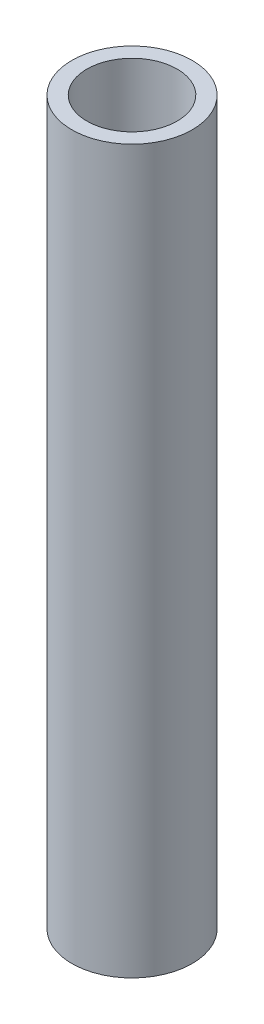
ISO-10303-21;
HEADER;
FILE_DESCRIPTION(('STEP AP214'),'2;1');
FILE_NAME('part.step','',(''),(''),'','','');
FILE_SCHEMA(('AUTOMOTIVE_DESIGN { 1 0 10303 214 1 1 1 1 }'));
ENDSEC;
DATA;
#1=APPLICATION_CONTEXT('core data for automotive mechanical design processes');
#2=APPLICATION_PROTOCOL_DEFINITION('international standard','automotive_design',2000,#1);
#3=PRODUCT_CONTEXT('',#1,'mechanical');
#4=PRODUCT('Part','Part','',(#3));
#5=PRODUCT_RELATED_PRODUCT_CATEGORY('part','',(#4));
#6=PRODUCT_DEFINITION_FORMATION('','',#4);
#7=PRODUCT_DEFINITION_CONTEXT('part definition',#1,'design');
#8=PRODUCT_DEFINITION('design','',#6,#7);
#9=PRODUCT_DEFINITION_SHAPE('','',#8);
#10=(LENGTH_UNIT() NAMED_UNIT(*) SI_UNIT(.MILLI.,.METRE.));
#11=(NAMED_UNIT(*) PLANE_ANGLE_UNIT() SI_UNIT($,.RADIAN.));
#12=(NAMED_UNIT(*) SI_UNIT($,.STERADIAN.) SOLID_ANGLE_UNIT());
#13=UNCERTAINTY_MEASURE_WITH_UNIT(LENGTH_MEASURE(1.E-05),#10,'distance_accuracy_value','');
#14=(GEOMETRIC_REPRESENTATION_CONTEXT(3) GLOBAL_UNCERTAINTY_ASSIGNED_CONTEXT((#13)) GLOBAL_UNIT_ASSIGNED_CONTEXT((#10,
#11,#12)) REPRESENTATION_CONTEXT('',''));
#15=CARTESIAN_POINT('',(0.,0.,0.));
#16=DIRECTION('',(0.,0.,1.));
#17=DIRECTION('',(1.,0.,0.));
#18=AXIS2_PLACEMENT_3D('',#15,#16,#17);
#19=CARTESIAN_POINT('',(0.,304.8,0.));
#20=DIRECTION('',(0.,1.,0.));
#21=DIRECTION('',(0.,0.,1.));
#22=AXIS2_PLACEMENT_3D('',#19,#20,#21);
#23=PLANE('',#22);
#24=CARTESIAN_POINT('',(0.,304.8,0.));
#25=DIRECTION('',(0.,1.,0.));
#26=DIRECTION('',(0.,0.,1.));
#27=AXIS2_PLACEMENT_3D('',#24,#25,#26);
#28=CIRCLE('',#27,25.4);
#29=CARTESIAN_POINT('',(0.,304.8,-25.4));
#30=VERTEX_POINT('',#29);
#31=EDGE_CURVE('E10',#30,#30,#28,.T.);
#32=ORIENTED_EDGE('',*,*,#31,.T.);
#33=EDGE_LOOP('',(#32));
#34=FACE_BOUND('',#33,.T.);
#35=CARTESIAN_POINT('',(0.,304.8,0.));
#36=DIRECTION('',(0.,1.,0.));
#37=DIRECTION('',(0.,0.,1.));
#38=AXIS2_PLACEMENT_3D('',#35,#36,#37);
#39=CIRCLE('',#38,19.05);
#40=CARTESIAN_POINT('',(0.,304.8,-19.05));
#41=VERTEX_POINT('',#40);
#42=EDGE_CURVE('E50',#41,#41,#39,.T.);
#43=ORIENTED_EDGE('',*,*,#42,.F.);
#44=EDGE_LOOP('',(#43));
#45=FACE_BOUND('',#44,.T.);
#46=ADVANCED_FACE('F37',(#34,#45),#23,.T.);
#47=CARTESIAN_POINT('',(0.,0.,0.));
#48=DIRECTION('',(0.,1.,0.));
#49=DIRECTION('',(0.,0.,1.));
#50=AXIS2_PLACEMENT_3D('',#47,#48,#49);
#51=PLANE('',#50);
#52=CARTESIAN_POINT('',(0.,0.,0.));
#53=DIRECTION('',(0.,-1.,0.));
#54=DIRECTION('',(0.,0.,-1.));
#55=AXIS2_PLACEMENT_3D('',#52,#53,#54);
#56=CIRCLE('',#55,24.1554);
#57=CARTESIAN_POINT('',(0.,0.,-24.1554));
#58=VERTEX_POINT('',#57);
#59=EDGE_CURVE('E55',#58,#58,#56,.T.);
#60=ORIENTED_EDGE('',*,*,#59,.F.);
#61=EDGE_LOOP('',(#60));
#62=FACE_BOUND('',#61,.T.);
#63=CARTESIAN_POINT('',(0.,0.,0.));
#64=DIRECTION('',(0.,1.,0.));
#65=DIRECTION('',(0.,0.,1.));
#66=AXIS2_PLACEMENT_3D('',#63,#64,#65);
#67=CIRCLE('',#66,25.4);
#68=CARTESIAN_POINT('',(0.,0.,-25.4));
#69=VERTEX_POINT('',#68);
#70=EDGE_CURVE('E41',#69,#69,#67,.T.);
#71=ORIENTED_EDGE('',*,*,#70,.F.);
#72=EDGE_LOOP('',(#71));
#73=FACE_BOUND('',#72,.T.);
#74=ADVANCED_FACE('F83',(#62,#73),#51,.F.);
#75=CARTESIAN_POINT('',(0.,304.8,0.));
#76=DIRECTION('',(0.,-1.,0.));
#77=DIRECTION('',(0.,0.,-1.));
#78=AXIS2_PLACEMENT_3D('',#75,#76,#77);
#79=CYLINDRICAL_SURFACE('',#78,25.4);
#80=CARTESIAN_POINT('',(0.,304.8,-25.4));
#81=CARTESIAN_POINT('',(0.,301.625,-25.4));
#82=CARTESIAN_POINT('',(0.,298.45,-25.4));
#83=CARTESIAN_POINT('',(0.,292.1,-25.4));
#84=CARTESIAN_POINT('',(0.,288.925,-25.4));
#85=CARTESIAN_POINT('',(0.,282.575,-25.4));
#86=CARTESIAN_POINT('',(0.,279.4,-25.4));
#87=CARTESIAN_POINT('',(0.,273.05,-25.4));
#88=CARTESIAN_POINT('',(0.,269.875,-25.4));
#89=CARTESIAN_POINT('',(0.,263.525,-25.4));
#90=CARTESIAN_POINT('',(0.,260.35,-25.4));
#91=CARTESIAN_POINT('',(0.,254.,-25.4));
#92=CARTESIAN_POINT('',(0.,250.825,-25.4));
#93=CARTESIAN_POINT('',(0.,244.475,-25.4));
#94=CARTESIAN_POINT('',(0.,241.3,-25.4));
#95=CARTESIAN_POINT('',(0.,234.95,-25.4));
#96=CARTESIAN_POINT('',(0.,231.775,-25.4));
#97=CARTESIAN_POINT('',(0.,225.425,-25.4));
#98=CARTESIAN_POINT('',(0.,222.25,-25.4));
#99=CARTESIAN_POINT('',(0.,215.9,-25.4));
#100=CARTESIAN_POINT('',(0.,212.725,-25.4));
#101=CARTESIAN_POINT('',(0.,206.375,-25.4));
#102=CARTESIAN_POINT('',(0.,203.2,-25.4));
#103=CARTESIAN_POINT('',(0.,196.85,-25.4));
#104=CARTESIAN_POINT('',(0.,193.675,-25.4));
#105=CARTESIAN_POINT('',(0.,187.325,-25.4));
#106=CARTESIAN_POINT('',(0.,184.15,-25.4));
#107=CARTESIAN_POINT('',(0.,177.8,-25.4));
#108=CARTESIAN_POINT('',(0.,174.625,-25.4));
#109=CARTESIAN_POINT('',(0.,168.275,-25.4));
#110=CARTESIAN_POINT('',(0.,165.1,-25.4));
#111=CARTESIAN_POINT('',(0.,158.75,-25.4));
#112=CARTESIAN_POINT('',(0.,155.575,-25.4));
#113=CARTESIAN_POINT('',(0.,149.225,-25.4));
#114=CARTESIAN_POINT('',(0.,146.05,-25.4));
#115=CARTESIAN_POINT('',(0.,139.7,-25.4));
#116=CARTESIAN_POINT('',(0.,136.525,-25.4));
#117=CARTESIAN_POINT('',(0.,130.175,-25.4));
#118=CARTESIAN_POINT('',(0.,127.,-25.4));
#119=CARTESIAN_POINT('',(0.,120.65,-25.4));
#120=CARTESIAN_POINT('',(0.,117.475,-25.4));
#121=CARTESIAN_POINT('',(0.,111.125,-25.4));
#122=CARTESIAN_POINT('',(0.,107.95,-25.4));
#123=CARTESIAN_POINT('',(0.,101.6,-25.4));
#124=CARTESIAN_POINT('',(0.,98.425,-25.4));
#125=CARTESIAN_POINT('',(0.,92.075,-25.4));
#126=CARTESIAN_POINT('',(0.,88.9,-25.4));
#127=CARTESIAN_POINT('',(0.,82.55,-25.4));
#128=CARTESIAN_POINT('',(0.,79.375,-25.4));
#129=CARTESIAN_POINT('',(0.,73.025,-25.4));
#130=CARTESIAN_POINT('',(0.,69.85,-25.4));
#131=CARTESIAN_POINT('',(0.,63.5,-25.4));
#132=CARTESIAN_POINT('',(0.,60.325,-25.4));
#133=CARTESIAN_POINT('',(0.,53.975,-25.4));
#134=CARTESIAN_POINT('',(0.,50.8,-25.4));
#135=CARTESIAN_POINT('',(0.,44.45,-25.4));
#136=CARTESIAN_POINT('',(0.,41.275,-25.4));
#137=CARTESIAN_POINT('',(0.,34.925,-25.4));
#138=CARTESIAN_POINT('',(0.,31.75,-25.4));
#139=CARTESIAN_POINT('',(0.,25.4,-25.4));
#140=CARTESIAN_POINT('',(0.,22.225,-25.4));
#141=CARTESIAN_POINT('',(0.,15.875,-25.4));
#142=CARTESIAN_POINT('',(0.,12.7,-25.4));
#143=CARTESIAN_POINT('',(0.,6.35,-25.4));
#144=CARTESIAN_POINT('',(0.,3.175,-25.4));
#145=CARTESIAN_POINT('',(0.,0.,-25.4));
#146=B_SPLINE_CURVE_WITH_KNOTS('',3,(#80,#81,#82,#83,#84,#85,#86,#87,#88,#89,#90,#91,#92,#93,
#94,#95,#96,#97,#98,#99,#100,#101,#102,#103,#104,#105,#106,#107,#108,#109,#110,#111,#112,#113,
#114,#115,#116,#117,#118,#119,#120,#121,#122,#123,#124,#125,#126,#127,#128,#129,#130,#131,#132,
#133,#134,#135,#136,#137,#138,#139,#140,#141,#142,#143,#144,#145),.UNSPECIFIED.,.F.,.F.,(4,2,2,
2,2,2,2,2,2,2,2,2,2,2,2,2,2,2,2,2,2,2,2,2,2,2,2,2,2,2,2,2,4),(0.,9.52499999999995,19.05,28.575,
38.1,47.625,57.15,66.675,76.2,85.725,95.2499999999999,104.775,114.3,123.825,133.35,142.875,
152.4,161.925,171.45,180.975,190.5,200.025,209.55,219.075,228.6,238.125,247.65,257.175,266.7,
276.225,285.75,295.275,304.8),.UNSPECIFIED.);
#147=EDGE_CURVE('BSEAM39',#30,#69,#146,.T.);
#148=ORIENTED_EDGE('',*,*,#31,.F.);
#149=ORIENTED_EDGE('',*,*,#70,.T.);
#150=ORIENTED_EDGE('',*,*,#147,.T.);
#151=ORIENTED_EDGE('',*,*,#147,.F.);
#152=EDGE_LOOP('',(#148,#150,#149,#151));
#153=FACE_BOUND('',#152,.T.);
#154=ADVANCED_FACE('F39',(#153),#79,.T.);
#155=CARTESIAN_POINT('',(0.,304.8,0.));
#156=DIRECTION('',(0.,-1.,0.));
#157=DIRECTION('',(0.,0.,-1.));
#158=AXIS2_PLACEMENT_3D('',#155,#156,#157);
#159=CYLINDRICAL_SURFACE('',#158,19.05);
#160=CARTESIAN_POINT('',(0.,12.7,0.));
#161=DIRECTION('',(0.,-1.,0.));
#162=DIRECTION('',(0.,0.,-1.));
#163=AXIS2_PLACEMENT_3D('',#160,#161,#162);
#164=CIRCLE('',#163,19.05);
#165=CARTESIAN_POINT('',(0.,12.7,-19.05));
#166=VERTEX_POINT('',#165);
#167=EDGE_CURVE('E63',#166,#166,#164,.T.);
#168=CARTESIAN_POINT('',(0.,12.7,-19.05));
#169=CARTESIAN_POINT('',(0.,15.7427083333334,-19.05));
#170=CARTESIAN_POINT('',(0.,18.7854166666667,-19.05));
#171=CARTESIAN_POINT('',(0.,24.8708333333334,-19.05));
#172=CARTESIAN_POINT('',(0.,27.9135416666667,-19.05));
#173=CARTESIAN_POINT('',(0.,33.9989583333334,-19.05));
#174=CARTESIAN_POINT('',(0.,37.0416666666667,-19.05));
#175=CARTESIAN_POINT('',(0.,43.1270833333334,-19.05));
#176=CARTESIAN_POINT('',(0.,46.1697916666667,-19.05));
#177=CARTESIAN_POINT('',(0.,52.2552083333334,-19.05));
#178=CARTESIAN_POINT('',(0.,55.2979166666667,-19.05));
#179=CARTESIAN_POINT('',(0.,61.3833333333333,-19.05));
#180=CARTESIAN_POINT('',(0.,64.4260416666667,-19.05));
#181=CARTESIAN_POINT('',(0.,70.5114583333333,-19.05));
#182=CARTESIAN_POINT('',(0.,73.5541666666667,-19.05));
#183=CARTESIAN_POINT('',(0.,79.6395833333333,-19.05));
#184=CARTESIAN_POINT('',(0.,82.6822916666667,-19.05));
#185=CARTESIAN_POINT('',(0.,88.7677083333333,-19.05));
#186=CARTESIAN_POINT('',(0.,91.8104166666667,-19.05));
#187=CARTESIAN_POINT('',(0.,97.8958333333333,-19.05));
#188=CARTESIAN_POINT('',(0.,100.938541666667,-19.05));
#189=CARTESIAN_POINT('',(0.,107.023958333333,-19.05));
#190=CARTESIAN_POINT('',(0.,110.066666666667,-19.05));
#191=CARTESIAN_POINT('',(0.,116.152083333333,-19.05));
#192=CARTESIAN_POINT('',(0.,119.194791666667,-19.05));
#193=CARTESIAN_POINT('',(0.,125.280208333333,-19.05));
#194=CARTESIAN_POINT('',(0.,128.322916666667,-19.05));
#195=CARTESIAN_POINT('',(0.,134.408333333333,-19.05));
#196=CARTESIAN_POINT('',(0.,137.451041666667,-19.05));
#197=CARTESIAN_POINT('',(0.,143.536458333333,-19.05));
#198=CARTESIAN_POINT('',(0.,146.579166666667,-19.05));
#199=CARTESIAN_POINT('',(0.,152.664583333333,-19.05));
#200=CARTESIAN_POINT('',(0.,155.707291666667,-19.05));
#201=CARTESIAN_POINT('',(0.,161.792708333333,-19.05));
#202=CARTESIAN_POINT('',(0.,164.835416666667,-19.05));
#203=CARTESIAN_POINT('',(0.,170.920833333333,-19.05));
#204=CARTESIAN_POINT('',(0.,173.963541666667,-19.05));
#205=CARTESIAN_POINT('',(0.,180.048958333333,-19.05));
#206=CARTESIAN_POINT('',(0.,183.091666666667,-19.05));
#207=CARTESIAN_POINT('',(0.,189.177083333333,-19.05));
#208=CARTESIAN_POINT('',(0.,192.219791666667,-19.05));
#209=CARTESIAN_POINT('',(0.,198.305208333333,-19.05));
#210=CARTESIAN_POINT('',(0.,201.347916666667,-19.05));
#211=CARTESIAN_POINT('',(0.,207.433333333333,-19.05));
#212=CARTESIAN_POINT('',(0.,210.476041666667,-19.05));
#213=CARTESIAN_POINT('',(0.,216.561458333333,-19.05));
#214=CARTESIAN_POINT('',(0.,219.604166666667,-19.05));
#215=CARTESIAN_POINT('',(0.,225.689583333333,-19.05));
#216=CARTESIAN_POINT('',(0.,228.732291666667,-19.05));
#217=CARTESIAN_POINT('',(0.,234.817708333333,-19.05));
#218=CARTESIAN_POINT('',(0.,237.860416666667,-19.05));
#219=CARTESIAN_POINT('',(0.,243.945833333333,-19.05));
#220=CARTESIAN_POINT('',(0.,246.988541666667,-19.05));
#221=CARTESIAN_POINT('',(0.,253.073958333333,-19.05));
#222=CARTESIAN_POINT('',(0.,256.116666666667,-19.05));
#223=CARTESIAN_POINT('',(0.,262.202083333333,-19.05));
#224=CARTESIAN_POINT('',(0.,265.244791666667,-19.05));
#225=CARTESIAN_POINT('',(0.,271.330208333333,-19.05));
#226=CARTESIAN_POINT('',(0.,274.372916666667,-19.05));
#227=CARTESIAN_POINT('',(0.,280.458333333333,-19.05));
#228=CARTESIAN_POINT('',(0.,283.501041666667,-19.05));
#229=CARTESIAN_POINT('',(0.,289.586458333333,-19.05));
#230=CARTESIAN_POINT('',(0.,292.629166666667,-19.05));
#231=CARTESIAN_POINT('',(0.,298.714583333333,-19.05));
#232=CARTESIAN_POINT('',(0.,301.757291666667,-19.05));
#233=CARTESIAN_POINT('',(0.,304.8,-19.05));
#234=B_SPLINE_CURVE_WITH_KNOTS('',3,(#168,#169,#170,#171,#172,#173,#174,#175,#176,#177,#178,
#179,#180,#181,#182,#183,#184,#185,#186,#187,#188,#189,#190,#191,#192,#193,#194,#195,#196,#197,
#198,#199,#200,#201,#202,#203,#204,#205,#206,#207,#208,#209,#210,#211,#212,#213,#214,#215,#216,
#217,#218,#219,#220,#221,#222,#223,#224,#225,#226,#227,#228,#229,#230,#231,#232,#233),
.UNSPECIFIED.,.F.,.F.,(4,2,2,2,2,2,2,2,2,2,2,2,2,2,2,2,2,2,2,2,2,2,2,2,2,2,2,2,2,2,2,2,4),(0.,
9.12812499999999,18.25625,27.384375,36.5125,45.640625,54.7687499999999,63.896875,73.025,
82.153125,91.28125,100.409375,109.5375,118.665625,127.79375,136.921875,146.05,155.178125,
164.30625,173.434375,182.5625,191.690625,200.81875,209.946875,219.075,228.203125,237.33125,
246.459375,255.5875,264.715625,273.84375,282.971875,292.1),.UNSPECIFIED.);
#235=EDGE_CURVE('BSEAM68',#166,#41,#234,.T.);
#236=ORIENTED_EDGE('',*,*,#167,.T.);
#237=ORIENTED_EDGE('',*,*,#42,.T.);
#238=ORIENTED_EDGE('',*,*,#235,.T.);
#239=ORIENTED_EDGE('',*,*,#235,.F.);
#240=EDGE_LOOP('',(#236,#238,#237,#239));
#241=FACE_BOUND('',#240,.T.);
#242=ADVANCED_FACE('F68',(#241),#159,.F.);
#243=CARTESIAN_POINT('',(0.,0.,0.));
#244=DIRECTION('',(0.,-1.,0.));
#245=DIRECTION('',(0.,0.,-1.));
#246=AXIS2_PLACEMENT_3D('',#243,#244,#245);
#247=CYLINDRICAL_SURFACE('',#246,24.1554);
#248=CARTESIAN_POINT('',(0.,12.7,0.));
#249=DIRECTION('',(0.,-1.,0.));
#250=DIRECTION('',(0.,0.,-1.));
#251=AXIS2_PLACEMENT_3D('',#248,#249,#250);
#252=CIRCLE('',#251,24.1554);
#253=CARTESIAN_POINT('',(0.,12.7,-24.1554));
#254=VERTEX_POINT('',#253);
#255=EDGE_CURVE('E59',#254,#254,#252,.T.);
#256=ORIENTED_EDGE('',*,*,#255,.F.);
#257=EDGE_LOOP('',(#256));
#258=FACE_BOUND('',#257,.T.);
#259=ORIENTED_EDGE('',*,*,#59,.T.);
#260=EDGE_LOOP('',(#259));
#261=FACE_BOUND('',#260,.T.);
#262=ADVANCED_FACE('F74',(#258,#261),#247,.F.);
#263=CARTESIAN_POINT('',(24.1554,12.7,0.));
#264=DIRECTION('',(0.,1.,0.));
#265=DIRECTION('',(0.,0.,1.));
#266=AXIS2_PLACEMENT_3D('',#263,#264,#265);
#267=PLANE('',#266);
#268=ORIENTED_EDGE('',*,*,#167,.F.);
#269=EDGE_LOOP('',(#268));
#270=FACE_BOUND('',#269,.T.);
#271=ORIENTED_EDGE('',*,*,#255,.T.);
#272=EDGE_LOOP('',(#271));
#273=FACE_BOUND('',#272,.T.);
#274=ADVANCED_FACE('F71',(#270,#273),#267,.F.);
#275=CLOSED_SHELL('',(#46,#74,#154,#242,#262,#274));
#276=MANIFOLD_SOLID_BREP('B2',#275);
#277=ADVANCED_BREP_SHAPE_REPRESENTATION('',(#18,#276),#14);
#278=SHAPE_DEFINITION_REPRESENTATION(#9,#277);
ENDSEC;
END-ISO-10303-21;
